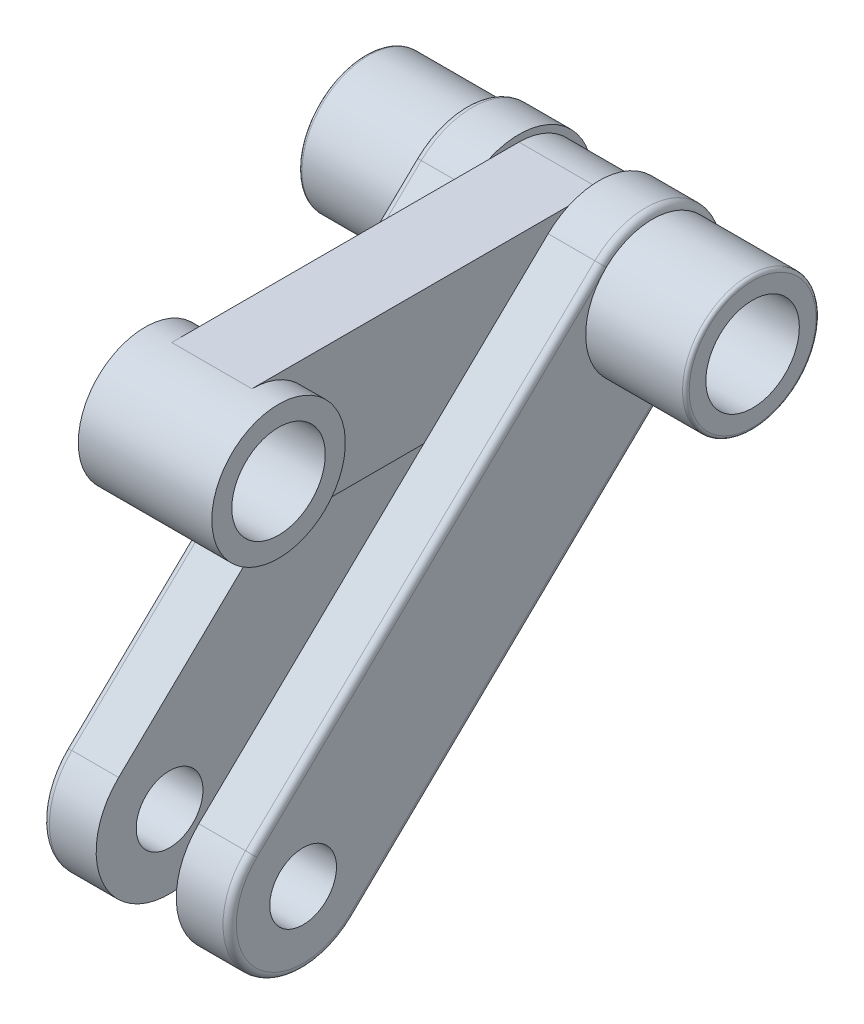
ISO-10303-21;
HEADER;
FILE_DESCRIPTION(('STEP AP214'),'2;1');
FILE_NAME('part.step','',(''),(''),'','','');
FILE_SCHEMA(('AUTOMOTIVE_DESIGN { 1 0 10303 214 1 1 1 1 }'));
ENDSEC;
DATA;
#1=APPLICATION_CONTEXT('core data for automotive mechanical design processes');
#2=APPLICATION_PROTOCOL_DEFINITION('international standard','automotive_design',2000,#1);
#3=PRODUCT_CONTEXT('',#1,'mechanical');
#4=PRODUCT('Part','Part','',(#3));
#5=PRODUCT_RELATED_PRODUCT_CATEGORY('part','',(#4));
#6=PRODUCT_DEFINITION_FORMATION('','',#4);
#7=PRODUCT_DEFINITION_CONTEXT('part definition',#1,'design');
#8=PRODUCT_DEFINITION('design','',#6,#7);
#9=PRODUCT_DEFINITION_SHAPE('','',#8);
#10=(LENGTH_UNIT() NAMED_UNIT(*) SI_UNIT(.MILLI.,.METRE.));
#11=(NAMED_UNIT(*) PLANE_ANGLE_UNIT() SI_UNIT($,.RADIAN.));
#12=(NAMED_UNIT(*) SI_UNIT($,.STERADIAN.) SOLID_ANGLE_UNIT());
#13=UNCERTAINTY_MEASURE_WITH_UNIT(LENGTH_MEASURE(1.E-05),#10,'distance_accuracy_value','');
#14=(GEOMETRIC_REPRESENTATION_CONTEXT(3) GLOBAL_UNCERTAINTY_ASSIGNED_CONTEXT((#13)) GLOBAL_UNIT_ASSIGNED_CONTEXT((#10,
#11,#12)) REPRESENTATION_CONTEXT('',''));
#15=CARTESIAN_POINT('',(0.,0.,0.));
#16=DIRECTION('',(0.,0.,1.));
#17=DIRECTION('',(1.,0.,0.));
#18=AXIS2_PLACEMENT_3D('',#15,#16,#17);
#19=CARTESIAN_POINT('',(-20.,0.,0.));
#20=DIRECTION('',(1.,0.,0.));
#21=DIRECTION('',(0.,0.,-1.));
#22=AXIS2_PLACEMENT_3D('',#19,#20,#21);
#23=PLANE('',#22);
#24=CARTESIAN_POINT('',(-20.,0.,0.));
#25=DIRECTION('',(1.,0.,0.));
#26=DIRECTION('',(0.,0.,-1.));
#27=AXIS2_PLACEMENT_3D('',#24,#25,#26);
#28=CIRCLE('',#27,10.);
#29=CARTESIAN_POINT('',(-20.,10.,0.));
#30=VERTEX_POINT('',#29);
#31=CARTESIAN_POINT('',(-20.,-10.,0.));
#32=VERTEX_POINT('',#31);
#33=EDGE_CURVE('E912',#30,#32,#28,.F.);
#34=ORIENTED_EDGE('',*,*,#33,.F.);
#35=DIRECTION('',(0.,0.,-1.));
#36=VECTOR('',#35,1.);
#37=CARTESIAN_POINT('',(-20.,10.,0.));
#38=LINE('',#37,#36);
#39=CARTESIAN_POINT('',(-20.,10.,-47.4174243050442));
#40=VERTEX_POINT('',#39);
#41=EDGE_CURVE('E808',#30,#40,#38,.T.);
#42=ORIENTED_EDGE('',*,*,#41,.T.);
#43=CARTESIAN_POINT('',(-20.,0.,-52.));
#44=DIRECTION('',(1.,0.,0.));
#45=DIRECTION('',(0.,0.,-1.));
#46=AXIS2_PLACEMENT_3D('',#43,#44,#45);
#47=CIRCLE('',#46,11.);
#48=CARTESIAN_POINT('',(-20.,7.92486428845387,-44.3713352407129));
#49=VERTEX_POINT('',#48);
#50=EDGE_CURVE('E828',#40,#49,#47,.T.);
#51=ORIENTED_EDGE('',*,*,#50,.T.);
#52=DIRECTION('',(0.,0.693514978117007,-0.720442208041261));
#53=VECTOR('',#52,1.);
#54=CARTESIAN_POINT('',(-20.,-18.0562837430499,-17.3814125340898));
#55=LINE('',#54,#53);
#56=CARTESIAN_POINT('',(-20.,-10.,-25.7504990449662));
#57=VERTEX_POINT('',#56);
#58=EDGE_CURVE('E928',#57,#49,#55,.T.);
#59=ORIENTED_EDGE('',*,*,#58,.F.);
#60=DIRECTION('',(0.,0.,-1.));
#61=VECTOR('',#60,1.);
#62=CARTESIAN_POINT('',(-20.,-10.,0.));
#63=LINE('',#62,#61);
#64=EDGE_CURVE('E801',#32,#57,#63,.T.);
#65=ORIENTED_EDGE('',*,*,#64,.F.);
#66=EDGE_LOOP('',(#34,#42,#51,#59,#65));
#67=FACE_BOUND('',#66,.T.);
#68=ADVANCED_FACE('F115',(#67),#23,.F.);
#69=CARTESIAN_POINT('',(-8.,0.,0.));
#70=DIRECTION('',(1.,0.,0.));
#71=DIRECTION('',(0.,0.,-1.));
#72=AXIS2_PLACEMENT_3D('',#69,#70,#71);
#73=PLANE('',#72);
#74=DIRECTION('',(0.,0.,-1.));
#75=VECTOR('',#74,1.);
#76=CARTESIAN_POINT('',(-8.,10.,0.));
#77=LINE('',#76,#75);
#78=CARTESIAN_POINT('',(-8.,10.,0.));
#79=VERTEX_POINT('',#78);
#80=CARTESIAN_POINT('',(-8.,10.,-47.4174243050442));
#81=VERTEX_POINT('',#80);
#82=EDGE_CURVE('E791',#79,#81,#77,.T.);
#83=ORIENTED_EDGE('',*,*,#82,.F.);
#84=CARTESIAN_POINT('',(-8.,0.,0.));
#85=DIRECTION('',(1.,0.,0.));
#86=DIRECTION('',(0.,0.,-1.));
#87=AXIS2_PLACEMENT_3D('',#84,#85,#86);
#88=CIRCLE('',#87,10.);
#89=CARTESIAN_POINT('',(-8.,-10.,0.));
#90=VERTEX_POINT('',#89);
#91=EDGE_CURVE('E824',#79,#90,#88,.F.);
#92=ORIENTED_EDGE('',*,*,#91,.T.);
#93=DIRECTION('',(0.,0.,-1.));
#94=VECTOR('',#93,1.);
#95=CARTESIAN_POINT('',(-8.,-10.,0.));
#96=LINE('',#95,#94);
#97=CARTESIAN_POINT('',(-8.,-10.,-25.7504990449662));
#98=VERTEX_POINT('',#97);
#99=EDGE_CURVE('E776',#90,#98,#96,.T.);
#100=ORIENTED_EDGE('',*,*,#99,.T.);
#101=DIRECTION('',(0.,0.693514978117007,-0.720442208041261));
#102=VECTOR('',#101,1.);
#103=CARTESIAN_POINT('',(-8.,-18.0562837430499,-17.3814125340898));
#104=LINE('',#103,#102);
#105=CARTESIAN_POINT('',(-8.,7.92486428845387,-44.3713352407129));
#106=VERTEX_POINT('',#105);
#107=EDGE_CURVE('E771',#98,#106,#104,.T.);
#108=ORIENTED_EDGE('',*,*,#107,.T.);
#109=CARTESIAN_POINT('',(-8.,0.,-52.));
#110=DIRECTION('',(1.,0.,0.));
#111=DIRECTION('',(0.,0.,-1.));
#112=AXIS2_PLACEMENT_3D('',#109,#110,#111);
#113=CIRCLE('',#112,11.);
#114=EDGE_CURVE('E871',#81,#106,#113,.T.);
#115=ORIENTED_EDGE('',*,*,#114,.F.);
#116=EDGE_LOOP('',(#83,#92,#100,#108,#115));
#117=FACE_BOUND('',#116,.T.);
#118=ADVANCED_FACE('F334',(#117),#73,.T.);
#119=CARTESIAN_POINT('',(-20.,-10.,0.));
#120=DIRECTION('',(0.,-1.,0.));
#121=DIRECTION('',(0.,0.,-1.));
#122=AXIS2_PLACEMENT_3D('',#119,#120,#121);
#123=PLANE('',#122);
#124=CARTESIAN_POINT('',(-20.,-9.99999999992471,5.48764602092361E-05));
#125=VERTEX_POINT('',#124);
#126=EDGE_CURVE('E802',#125,#32,#63,.T.);
#127=ORIENTED_EDGE('',*,*,#126,.T.);
#128=ORIENTED_EDGE('',*,*,#64,.T.);
#129=CARTESIAN_POINT('',(-20.,-9.99999999999999,-52.));
#130=VERTEX_POINT('',#129);
#131=EDGE_CURVE('E799',#57,#130,#63,.T.);
#132=ORIENTED_EDGE('',*,*,#131,.T.);
#133=DIRECTION('',(1.,0.,0.));
#134=VECTOR('',#133,1.);
#135=CARTESIAN_POINT('',(-20.,-9.99999999999999,-52.));
#136=LINE('',#135,#134);
#137=CARTESIAN_POINT('',(-8.,-9.99999999999999,-52.));
#138=VERTEX_POINT('',#137);
#139=EDGE_CURVE('E777',#130,#138,#136,.T.);
#140=ORIENTED_EDGE('',*,*,#139,.T.);
#141=EDGE_CURVE('E762',#98,#138,#96,.T.);
#142=ORIENTED_EDGE('',*,*,#141,.F.);
#143=ORIENTED_EDGE('',*,*,#99,.F.);
#144=CARTESIAN_POINT('',(-8.,-9.99999999984943,5.4876460208823E-05));
#145=VERTEX_POINT('',#144);
#146=EDGE_CURVE('E783',#145,#90,#96,.T.);
#147=ORIENTED_EDGE('',*,*,#146,.F.);
#148=DIRECTION('',(1.,0.,0.));
#149=VECTOR('',#148,1.);
#150=CARTESIAN_POINT('',(-20.,-9.99999999992471,5.48764602092361E-05));
#151=LINE('',#150,#149);
#152=EDGE_CURVE('E935',#125,#145,#151,.T.);
#153=ORIENTED_EDGE('',*,*,#152,.F.);
#154=EDGE_LOOP('',(#127,#128,#132,#140,#142,#143,#147,#153));
#155=FACE_BOUND('',#154,.T.);
#156=ADVANCED_FACE('F339',(#155),#123,.T.);
#157=CARTESIAN_POINT('',(-20.,0.,0.));
#158=DIRECTION('',(1.,0.,0.));
#159=DIRECTION('',(0.,0.,-1.));
#160=AXIS2_PLACEMENT_3D('',#157,#158,#159);
#161=CYLINDRICAL_SURFACE('',#160,10.);
#162=ORIENTED_EDGE('',*,*,#152,.T.);
#163=ORIENTED_EDGE('',*,*,#146,.T.);
#164=ORIENTED_EDGE('',*,*,#91,.F.);
#165=CARTESIAN_POINT('',(-8.,9.99999999984943,5.48764602112723E-05));
#166=VERTEX_POINT('',#165);
#167=EDGE_CURVE('E794',#166,#79,#77,.T.);
#168=ORIENTED_EDGE('',*,*,#167,.F.);
#169=DIRECTION('',(1.,0.,0.));
#170=VECTOR('',#169,1.);
#171=CARTESIAN_POINT('',(-20.,9.99999999992471,5.48764602116854E-05));
#172=LINE('',#171,#170);
#173=CARTESIAN_POINT('',(-20.,9.99999999992471,5.48764602116854E-05));
#174=VERTEX_POINT('',#173);
#175=EDGE_CURVE('E819',#174,#166,#172,.T.);
#176=ORIENTED_EDGE('',*,*,#175,.F.);
#177=EDGE_CURVE('E813',#174,#30,#38,.T.);
#178=ORIENTED_EDGE('',*,*,#177,.T.);
#179=ORIENTED_EDGE('',*,*,#33,.T.);
#180=ORIENTED_EDGE('',*,*,#126,.F.);
#181=EDGE_LOOP('',(#162,#163,#164,#168,#176,#178,#179,#180));
#182=FACE_BOUND('',#181,.T.);
#183=CARTESIAN_POINT('',(-4.,0.,0.));
#184=DIRECTION('',(-1.,0.,0.));
#185=DIRECTION('',(0.,0.,1.));
#186=AXIS2_PLACEMENT_3D('',#183,#184,#185);
#187=CIRCLE('',#186,10.);
#188=CARTESIAN_POINT('',(-4.,0.,10.));
#189=VERTEX_POINT('',#188);
#190=EDGE_CURVE('E910',#189,#189,#187,.T.);
#191=ORIENTED_EDGE('',*,*,#190,.T.);
#192=EDGE_LOOP('',(#191));
#193=FACE_BOUND('',#192,.T.);
#194=CARTESIAN_POINT('',(-24.,0.,0.));
#195=DIRECTION('',(-1.,0.,0.));
#196=DIRECTION('',(0.,0.,1.));
#197=AXIS2_PLACEMENT_3D('',#194,#195,#196);
#198=CIRCLE('',#197,10.);
#199=CARTESIAN_POINT('',(-24.,0.,10.));
#200=VERTEX_POINT('',#199);
#201=EDGE_CURVE('E907',#200,#200,#198,.T.);
#202=ORIENTED_EDGE('',*,*,#201,.F.);
#203=EDGE_LOOP('',(#202));
#204=FACE_BOUND('',#203,.T.);
#205=ADVANCED_FACE('F351',(#182,#193,#204),#161,.T.);
#206=CARTESIAN_POINT('',(-20.,10.,0.));
#207=DIRECTION('',(0.,-1.,0.));
#208=DIRECTION('',(0.,0.,-1.));
#209=AXIS2_PLACEMENT_3D('',#206,#207,#208);
#210=PLANE('',#209);
#211=ORIENTED_EDGE('',*,*,#167,.T.);
#212=ORIENTED_EDGE('',*,*,#82,.T.);
#213=CARTESIAN_POINT('',(-8.,10.,-52.));
#214=VERTEX_POINT('',#213);
#215=EDGE_CURVE('E788',#81,#214,#77,.T.);
#216=ORIENTED_EDGE('',*,*,#215,.T.);
#217=DIRECTION('',(1.,0.,0.));
#218=VECTOR('',#217,1.);
#219=CARTESIAN_POINT('',(-20.,10.,-52.));
#220=LINE('',#219,#218);
#221=CARTESIAN_POINT('',(-20.,10.,-52.));
#222=VERTEX_POINT('',#221);
#223=EDGE_CURVE('E820',#222,#214,#220,.T.);
#224=ORIENTED_EDGE('',*,*,#223,.F.);
#225=EDGE_CURVE('E807',#40,#222,#38,.T.);
#226=ORIENTED_EDGE('',*,*,#225,.F.);
#227=ORIENTED_EDGE('',*,*,#41,.F.);
#228=ORIENTED_EDGE('',*,*,#177,.F.);
#229=ORIENTED_EDGE('',*,*,#175,.T.);
#230=EDGE_LOOP('',(#211,#212,#216,#224,#226,#227,#228,#229));
#231=FACE_BOUND('',#230,.T.);
#232=ADVANCED_FACE('F357',(#231),#210,.F.);
#233=CARTESIAN_POINT('',(-20.,0.,-52.));
#234=DIRECTION('',(1.,0.,0.));
#235=DIRECTION('',(0.,0.,-1.));
#236=AXIS2_PLACEMENT_3D('',#233,#234,#235);
#237=CYLINDRICAL_SURFACE('',#236,10.);
#238=ORIENTED_EDGE('',*,*,#139,.F.);
#239=CARTESIAN_POINT('',(-20.,0.,-52.));
#240=DIRECTION('',(1.,0.,0.));
#241=DIRECTION('',(0.,0.,-1.));
#242=AXIS2_PLACEMENT_3D('',#239,#240,#241);
#243=CIRCLE('',#242,10.);
#244=EDGE_CURVE('E785',#130,#222,#243,.T.);
#245=ORIENTED_EDGE('',*,*,#244,.T.);
#246=ORIENTED_EDGE('',*,*,#223,.T.);
#247=CARTESIAN_POINT('',(-8.,0.,-52.));
#248=DIRECTION('',(1.,0.,0.));
#249=DIRECTION('',(0.,0.,-1.));
#250=AXIS2_PLACEMENT_3D('',#247,#248,#249);
#251=CIRCLE('',#250,10.);
#252=EDGE_CURVE('E787',#138,#214,#251,.T.);
#253=ORIENTED_EDGE('',*,*,#252,.F.);
#254=EDGE_LOOP('',(#238,#245,#246,#253));
#255=FACE_BOUND('',#254,.T.);
#256=ADVANCED_FACE('F345',(#255),#237,.T.);
#257=CARTESIAN_POINT('',(-8.,0.,0.));
#258=DIRECTION('',(1.,0.,0.));
#259=DIRECTION('',(0.,0.,-1.));
#260=AXIS2_PLACEMENT_3D('',#257,#258,#259);
#261=PLANE('',#260);
#262=CARTESIAN_POINT('',(-8.,-50.3689230785121,0.324606251288995));
#263=DIRECTION('',(1.,0.,0.));
#264=DIRECTION('',(0.,0.,-1.));
#265=AXIS2_PLACEMENT_3D('',#262,#263,#264);
#266=CIRCLE('',#265,5.);
#267=CARTESIAN_POINT('',(-8.,-50.3689230785121,-4.67539374871101));
#268=VERTEX_POINT('',#267);
#269=EDGE_CURVE('E758',#268,#268,#266,.T.);
#270=ORIENTED_EDGE('',*,*,#269,.T.);
#271=EDGE_LOOP('',(#270));
#272=FACE_BOUND('',#271,.T.);
#273=CARTESIAN_POINT('',(-8.,-42.4440587900583,7.95327101057607));
#274=VERTEX_POINT('',#273);
#275=EDGE_CURVE('E765',#274,#98,#104,.T.);
#276=ORIENTED_EDGE('',*,*,#275,.T.);
#277=ORIENTED_EDGE('',*,*,#141,.T.);
#278=ORIENTED_EDGE('',*,*,#252,.T.);
#279=ORIENTED_EDGE('',*,*,#215,.F.);
#280=CARTESIAN_POINT('',(-8.,-7.92486428845388,-59.6286647592871));
#281=VERTEX_POINT('',#280);
#282=EDGE_CURVE('E775',#281,#81,#113,.T.);
#283=ORIENTED_EDGE('',*,*,#282,.F.);
#284=DIRECTION('',(0.,0.693514978117007,-0.720442208041261));
#285=VECTOR('',#284,1.);
#286=CARTESIAN_POINT('',(-8.,-33.9060123199576,-32.638742052664));
#287=LINE('',#286,#285);
#288=CARTESIAN_POINT('',(-8.,-58.293787366966,-7.30405850799808));
#289=VERTEX_POINT('',#288);
#290=EDGE_CURVE('E869',#289,#281,#287,.T.);
#291=ORIENTED_EDGE('',*,*,#290,.F.);
#292=CARTESIAN_POINT('',(-8.,-50.3689230785121,0.324606251288995));
#293=DIRECTION('',(1.,0.,0.));
#294=DIRECTION('',(0.,0.,-1.));
#295=AXIS2_PLACEMENT_3D('',#292,#293,#294);
#296=CIRCLE('',#295,11.);
#297=EDGE_CURVE('E767',#274,#289,#296,.T.);
#298=ORIENTED_EDGE('',*,*,#297,.F.);
#299=EDGE_LOOP('',(#276,#277,#278,#279,#283,#291,#298));
#300=FACE_BOUND('',#299,.T.);
#301=ADVANCED_FACE('F365',(#272,#300),#261,.F.);
#302=CARTESIAN_POINT('',(-8.,0.,-52.));
#303=DIRECTION('',(1.,0.,0.));
#304=DIRECTION('',(0.,0.,-1.));
#305=AXIS2_PLACEMENT_3D('',#302,#303,#304);
#306=CYLINDRICAL_SURFACE('',#305,11.);
#307=DIRECTION('',(1.,0.,0.));
#308=VECTOR('',#307,1.);
#309=CARTESIAN_POINT('',(-8.,7.92486428845387,-44.3713352407129));
#310=LINE('',#309,#308);
#311=CARTESIAN_POINT('',(-1.,7.92486428845387,-44.3713352407129));
#312=VERTEX_POINT('',#311);
#313=EDGE_CURVE('E877',#106,#312,#310,.T.);
#314=ORIENTED_EDGE('',*,*,#313,.T.);
#315=CARTESIAN_POINT('',(-1.,0.,-52.));
#316=DIRECTION('',(1.,0.,0.));
#317=DIRECTION('',(0.,0.,-1.));
#318=AXIS2_PLACEMENT_3D('',#315,#316,#317);
#319=CIRCLE('',#318,11.);
#320=CARTESIAN_POINT('',(-1.,-7.92486428845388,-59.6286647592871));
#321=VERTEX_POINT('',#320);
#322=EDGE_CURVE('E841',#312,#321,#319,.F.);
#323=ORIENTED_EDGE('',*,*,#322,.T.);
#324=DIRECTION('',(1.,0.,0.));
#325=VECTOR('',#324,1.);
#326=CARTESIAN_POINT('',(-8.,-7.92486428845388,-59.6286647592871));
#327=LINE('',#326,#325);
#328=EDGE_CURVE('E879',#281,#321,#327,.T.);
#329=ORIENTED_EDGE('',*,*,#328,.F.);
#330=ORIENTED_EDGE('',*,*,#282,.T.);
#331=ORIENTED_EDGE('',*,*,#114,.T.);
#332=EDGE_LOOP('',(#314,#323,#329,#330,#331));
#333=FACE_BOUND('',#332,.T.);
#334=ADVANCED_FACE('F587',(#333),#306,.T.);
#335=CARTESIAN_POINT('',(-8.,-50.3689230785121,0.324606251288995));
#336=DIRECTION('',(1.,0.,0.));
#337=DIRECTION('',(0.,0.,-1.));
#338=AXIS2_PLACEMENT_3D('',#335,#336,#337);
#339=CYLINDRICAL_SURFACE('',#338,5.);
#340=ORIENTED_EDGE('',*,*,#269,.F.);
#341=EDGE_LOOP('',(#340));
#342=FACE_BOUND('',#341,.T.);
#343=CARTESIAN_POINT('',(0.,-50.3689230785121,0.324606251288995));
#344=DIRECTION('',(1.,0.,0.));
#345=DIRECTION('',(0.,0.,-1.));
#346=AXIS2_PLACEMENT_3D('',#343,#344,#345);
#347=CIRCLE('',#346,5.);
#348=CARTESIAN_POINT('',(0.,-50.3689230785121,-4.67539374871101));
#349=VERTEX_POINT('',#348);
#350=EDGE_CURVE('E853',#349,#349,#347,.T.);
#351=ORIENTED_EDGE('',*,*,#350,.T.);
#352=EDGE_LOOP('',(#351));
#353=FACE_BOUND('',#352,.T.);
#354=ADVANCED_FACE('F342',(#342,#353),#339,.F.);
#355=CARTESIAN_POINT('',(-8.,-33.9060123199576,-32.638742052664));
#356=DIRECTION('',(0.,-0.720442208041261,-0.693514978117007));
#357=DIRECTION('',(0.,0.693514978117007,-0.720442208041261));
#358=AXIS2_PLACEMENT_3D('',#355,#356,#357);
#359=PLANE('',#358);
#360=ORIENTED_EDGE('',*,*,#328,.T.);
#361=DIRECTION('',(0.,0.693514978117007,-0.720442208041261));
#362=VECTOR('',#361,1.);
#363=CARTESIAN_POINT('',(-1.,-33.9060123199576,-32.638742052664));
#364=LINE('',#363,#362);
#365=CARTESIAN_POINT('',(-1.,-58.293787366966,-7.30405850799808));
#366=VERTEX_POINT('',#365);
#367=EDGE_CURVE('E843',#321,#366,#364,.F.);
#368=ORIENTED_EDGE('',*,*,#367,.T.);
#369=DIRECTION('',(1.,0.,0.));
#370=VECTOR('',#369,1.);
#371=CARTESIAN_POINT('',(-8.,-58.293787366966,-7.30405850799808));
#372=LINE('',#371,#370);
#373=EDGE_CURVE('E772',#289,#366,#372,.T.);
#374=ORIENTED_EDGE('',*,*,#373,.F.);
#375=ORIENTED_EDGE('',*,*,#290,.T.);
#376=EDGE_LOOP('',(#360,#368,#374,#375));
#377=FACE_BOUND('',#376,.T.);
#378=ADVANCED_FACE('F613',(#377),#359,.T.);
#379=CARTESIAN_POINT('',(-8.,-50.3689230785121,0.324606251288995));
#380=DIRECTION('',(1.,0.,0.));
#381=DIRECTION('',(0.,0.,-1.));
#382=AXIS2_PLACEMENT_3D('',#379,#380,#381);
#383=CYLINDRICAL_SURFACE('',#382,11.);
#384=ORIENTED_EDGE('',*,*,#373,.T.);
#385=CARTESIAN_POINT('',(-1.,-50.3689230785121,0.324606251288995));
#386=DIRECTION('',(1.,0.,0.));
#387=DIRECTION('',(0.,0.,-1.));
#388=AXIS2_PLACEMENT_3D('',#385,#386,#387);
#389=CIRCLE('',#388,11.);
#390=CARTESIAN_POINT('',(-1.,-42.4440587900583,7.95327101057607));
#391=VERTEX_POINT('',#390);
#392=EDGE_CURVE('E839',#366,#391,#389,.F.);
#393=ORIENTED_EDGE('',*,*,#392,.T.);
#394=DIRECTION('',(1.,0.,0.));
#395=VECTOR('',#394,1.);
#396=CARTESIAN_POINT('',(-8.,-42.4440587900583,7.95327101057607));
#397=LINE('',#396,#395);
#398=EDGE_CURVE('E822',#274,#391,#397,.T.);
#399=ORIENTED_EDGE('',*,*,#398,.F.);
#400=ORIENTED_EDGE('',*,*,#297,.T.);
#401=EDGE_LOOP('',(#384,#393,#399,#400));
#402=FACE_BOUND('',#401,.T.);
#403=ADVANCED_FACE('F606',(#402),#383,.T.);
#404=CARTESIAN_POINT('',(-8.,-18.0562837430499,-17.3814125340898));
#405=DIRECTION('',(0.,-0.720442208041261,-0.693514978117007));
#406=DIRECTION('',(0.,0.693514978117007,-0.720442208041261));
#407=AXIS2_PLACEMENT_3D('',#404,#405,#406);
#408=PLANE('',#407);
#409=ORIENTED_EDGE('',*,*,#398,.T.);
#410=DIRECTION('',(0.,0.693514978117007,-0.720442208041261));
#411=VECTOR('',#410,1.);
#412=CARTESIAN_POINT('',(-1.,7.92486428845387,-44.3713352407129));
#413=LINE('',#412,#411);
#414=EDGE_CURVE('E292',#391,#312,#413,.T.);
#415=ORIENTED_EDGE('',*,*,#414,.T.);
#416=ORIENTED_EDGE('',*,*,#313,.F.);
#417=ORIENTED_EDGE('',*,*,#107,.F.);
#418=ORIENTED_EDGE('',*,*,#275,.F.);
#419=EDGE_LOOP('',(#409,#415,#416,#417,#418));
#420=FACE_BOUND('',#419,.T.);
#421=ADVANCED_FACE('F597',(#420),#408,.F.);
#422=CARTESIAN_POINT('',(0.,0.,0.));
#423=DIRECTION('',(1.,0.,0.));
#424=DIRECTION('',(0.,0.,-1.));
#425=AXIS2_PLACEMENT_3D('',#422,#423,#424);
#426=PLANE('',#425);
#427=DIRECTION('',(0.,0.693514978117007,-0.720442208041261));
#428=VECTOR('',#427,1.);
#429=CARTESIAN_POINT('',(0.,-33.1855701119164,-31.945227074547));
#430=LINE('',#429,#428);
#431=CARTESIAN_POINT('',(0.,-57.5733451589248,-6.61054352988108));
#432=VERTEX_POINT('',#431);
#433=CARTESIAN_POINT('',(0.,-7.20442208041261,-58.9351497811701));
#434=VERTEX_POINT('',#433);
#435=EDGE_CURVE('E832',#432,#434,#430,.T.);
#436=ORIENTED_EDGE('',*,*,#435,.T.);
#437=CARTESIAN_POINT('',(0.,0.,-52.));
#438=DIRECTION('',(1.,0.,0.));
#439=DIRECTION('',(0.,0.,-1.));
#440=AXIS2_PLACEMENT_3D('',#437,#438,#439);
#441=CIRCLE('',#440,9.99999999999975);
#442=CARTESIAN_POINT('',(0.,7.20442208041261,-45.0648502188299));
#443=VERTEX_POINT('',#442);
#444=EDGE_CURVE('E277',#434,#443,#441,.F.);
#445=ORIENTED_EDGE('',*,*,#444,.T.);
#446=DIRECTION('',(0.,0.693514978117007,-0.720442208041261));
#447=VECTOR('',#446,1.);
#448=CARTESIAN_POINT('',(0.,-43.1645009980995,7.25975603245907));
#449=LINE('',#448,#447);
#450=CARTESIAN_POINT('',(0.,-43.1645009980995,7.25975603245907));
#451=VERTEX_POINT('',#450);
#452=EDGE_CURVE('E830',#443,#451,#449,.F.);
#453=ORIENTED_EDGE('',*,*,#452,.T.);
#454=CARTESIAN_POINT('',(0.,-50.3689230785121,0.324606251288995));
#455=DIRECTION('',(1.,0.,0.));
#456=DIRECTION('',(0.,0.,-1.));
#457=AXIS2_PLACEMENT_3D('',#454,#455,#456);
#458=CIRCLE('',#457,9.99999999999999);
#459=EDGE_CURVE('E834',#451,#432,#458,.T.);
#460=ORIENTED_EDGE('',*,*,#459,.T.);
#461=EDGE_LOOP('',(#436,#445,#453,#460));
#462=FACE_BOUND('',#461,.T.);
#463=ORIENTED_EDGE('',*,*,#350,.F.);
#464=EDGE_LOOP('',(#463));
#465=FACE_BOUND('',#464,.T.);
#466=ADVANCED_FACE('F582',(#462,#465),#426,.T.);
#467=CARTESIAN_POINT('',(-20.,-50.3689230785121,0.324606251288995));
#468=DIRECTION('',(-1.,0.,0.));
#469=DIRECTION('',(0.,0.,1.));
#470=AXIS2_PLACEMENT_3D('',#467,#468,#469);
#471=CYLINDRICAL_SURFACE('',#470,11.);
#472=DIRECTION('',(-1.,0.,0.));
#473=VECTOR('',#472,1.);
#474=CARTESIAN_POINT('',(-20.,-42.4440587900583,7.95327101057607));
#475=LINE('',#474,#473);
#476=CARTESIAN_POINT('',(-20.,-42.4440587900583,7.95327101057607));
#477=VERTEX_POINT('',#476);
#478=CARTESIAN_POINT('',(-27.,-42.4440587900583,7.95327101057607));
#479=VERTEX_POINT('',#478);
#480=EDGE_CURVE('E849',#477,#479,#475,.T.);
#481=ORIENTED_EDGE('',*,*,#480,.T.);
#482=CARTESIAN_POINT('',(-27.,-50.3689230785121,0.324606251288995));
#483=DIRECTION('',(-1.,0.,0.));
#484=DIRECTION('',(0.,0.,1.));
#485=AXIS2_PLACEMENT_3D('',#482,#483,#484);
#486=CIRCLE('',#485,11.);
#487=CARTESIAN_POINT('',(-27.,-58.293787366966,-7.30405850799808));
#488=VERTEX_POINT('',#487);
#489=EDGE_CURVE('E284',#479,#488,#486,.F.);
#490=ORIENTED_EDGE('',*,*,#489,.T.);
#491=DIRECTION('',(-1.,0.,0.));
#492=VECTOR('',#491,1.);
#493=CARTESIAN_POINT('',(-20.,-58.293787366966,-7.30405850799808));
#494=LINE('',#493,#492);
#495=CARTESIAN_POINT('',(-20.,-58.293787366966,-7.30405850799808));
#496=VERTEX_POINT('',#495);
#497=EDGE_CURVE('E848',#496,#488,#494,.T.);
#498=ORIENTED_EDGE('',*,*,#497,.F.);
#499=CARTESIAN_POINT('',(-20.,-50.3689230785121,0.324606251288995));
#500=DIRECTION('',(1.,0.,0.));
#501=DIRECTION('',(0.,0.,-1.));
#502=AXIS2_PLACEMENT_3D('',#499,#500,#501);
#503=CIRCLE('',#502,11.);
#504=EDGE_CURVE('E918',#477,#496,#503,.T.);
#505=ORIENTED_EDGE('',*,*,#504,.F.);
#506=EDGE_LOOP('',(#481,#490,#498,#505));
#507=FACE_BOUND('',#506,.T.);
#508=ADVANCED_FACE('F580',(#507),#471,.T.);
#509=CARTESIAN_POINT('',(-20.,-33.9060123199576,-32.638742052664));
#510=DIRECTION('',(0.,0.720442208041261,0.693514978117007));
#511=DIRECTION('',(0.,-0.693514978117007,0.720442208041261));
#512=AXIS2_PLACEMENT_3D('',#509,#510,#511);
#513=PLANE('',#512);
#514=ORIENTED_EDGE('',*,*,#497,.T.);
#515=DIRECTION('',(0.,0.693514978117007,-0.720442208041261));
#516=VECTOR('',#515,1.);
#517=CARTESIAN_POINT('',(-27.,-7.92486428845388,-59.6286647592871));
#518=LINE('',#517,#516);
#519=CARTESIAN_POINT('',(-27.,-7.92486428845388,-59.6286647592871));
#520=VERTEX_POINT('',#519);
#521=EDGE_CURVE('E134',#488,#520,#518,.T.);
#522=ORIENTED_EDGE('',*,*,#521,.T.);
#523=DIRECTION('',(-1.,0.,0.));
#524=VECTOR('',#523,1.);
#525=CARTESIAN_POINT('',(-20.,-7.92486428845388,-59.6286647592871));
#526=LINE('',#525,#524);
#527=CARTESIAN_POINT('',(-20.,-7.92486428845386,-59.6286647592871));
#528=VERTEX_POINT('',#527);
#529=EDGE_CURVE('E857',#528,#520,#526,.T.);
#530=ORIENTED_EDGE('',*,*,#529,.F.);
#531=DIRECTION('',(0.,0.693514978117007,-0.720442208041261));
#532=VECTOR('',#531,1.);
#533=CARTESIAN_POINT('',(-20.,-33.9060123199576,-32.638742052664));
#534=LINE('',#533,#532);
#535=EDGE_CURVE('E855',#496,#528,#534,.T.);
#536=ORIENTED_EDGE('',*,*,#535,.F.);
#537=EDGE_LOOP('',(#514,#522,#530,#536));
#538=FACE_BOUND('',#537,.T.);
#539=ADVANCED_FACE('F567',(#538),#513,.F.);
#540=CARTESIAN_POINT('',(-20.,0.,-52.));
#541=DIRECTION('',(-1.,0.,0.));
#542=DIRECTION('',(0.,0.,1.));
#543=AXIS2_PLACEMENT_3D('',#540,#541,#542);
#544=CYLINDRICAL_SURFACE('',#543,11.);
#545=ORIENTED_EDGE('',*,*,#529,.T.);
#546=CARTESIAN_POINT('',(-27.,0.,-52.));
#547=DIRECTION('',(-1.,0.,0.));
#548=DIRECTION('',(0.,0.,1.));
#549=AXIS2_PLACEMENT_3D('',#546,#547,#548);
#550=CIRCLE('',#549,11.);
#551=CARTESIAN_POINT('',(-27.,7.92486428845387,-44.3713352407129));
#552=VERTEX_POINT('',#551);
#553=EDGE_CURVE('E130',#520,#552,#550,.F.);
#554=ORIENTED_EDGE('',*,*,#553,.T.);
#555=DIRECTION('',(-1.,0.,0.));
#556=VECTOR('',#555,1.);
#557=CARTESIAN_POINT('',(-20.,7.92486428845387,-44.3713352407129));
#558=LINE('',#557,#556);
#559=EDGE_CURVE('E858',#49,#552,#558,.T.);
#560=ORIENTED_EDGE('',*,*,#559,.F.);
#561=ORIENTED_EDGE('',*,*,#50,.F.);
#562=EDGE_CURVE('E923',#528,#40,#47,.T.);
#563=ORIENTED_EDGE('',*,*,#562,.F.);
#564=EDGE_LOOP('',(#545,#554,#560,#561,#563));
#565=FACE_BOUND('',#564,.T.);
#566=ADVANCED_FACE('F557',(#565),#544,.T.);
#567=CARTESIAN_POINT('',(-20.,-50.3689230785121,0.324606251288995));
#568=DIRECTION('',(-1.,0.,0.));
#569=DIRECTION('',(0.,0.,1.));
#570=AXIS2_PLACEMENT_3D('',#567,#568,#569);
#571=CYLINDRICAL_SURFACE('',#570,5.);
#572=CARTESIAN_POINT('',(-20.,-50.3689230785121,0.324606251288995));
#573=DIRECTION('',(1.,0.,0.));
#574=DIRECTION('',(0.,0.,-1.));
#575=AXIS2_PLACEMENT_3D('',#572,#573,#574);
#576=CIRCLE('',#575,5.);
#577=CARTESIAN_POINT('',(-20.,-50.3689230785121,-4.67539374871101));
#578=VERTEX_POINT('',#577);
#579=EDGE_CURVE('E919',#578,#578,#576,.T.);
#580=ORIENTED_EDGE('',*,*,#579,.T.);
#581=EDGE_LOOP('',(#580));
#582=FACE_BOUND('',#581,.T.);
#583=CARTESIAN_POINT('',(-28.,-50.3689230785121,0.324606251288995));
#584=DIRECTION('',(1.,0.,0.));
#585=DIRECTION('',(0.,0.,-1.));
#586=AXIS2_PLACEMENT_3D('',#583,#584,#585);
#587=CIRCLE('',#586,5.);
#588=CARTESIAN_POINT('',(-28.,-50.3689230785121,-4.67539374871101));
#589=VERTEX_POINT('',#588);
#590=EDGE_CURVE('E861',#589,#589,#587,.T.);
#591=ORIENTED_EDGE('',*,*,#590,.F.);
#592=EDGE_LOOP('',(#591));
#593=FACE_BOUND('',#592,.T.);
#594=ADVANCED_FACE('F553',(#582,#593),#571,.F.);
#595=CARTESIAN_POINT('',(-20.,-18.0562837430499,-17.3814125340898));
#596=DIRECTION('',(0.,0.720442208041261,0.693514978117007));
#597=DIRECTION('',(0.,-0.693514978117007,0.720442208041261));
#598=AXIS2_PLACEMENT_3D('',#595,#596,#597);
#599=PLANE('',#598);
#600=ORIENTED_EDGE('',*,*,#559,.T.);
#601=DIRECTION('',(0.,0.693514978117007,-0.720442208041261));
#602=VECTOR('',#601,1.);
#603=CARTESIAN_POINT('',(-27.,-18.0562837430499,-17.3814125340898));
#604=LINE('',#603,#602);
#605=EDGE_CURVE('E295',#552,#479,#604,.F.);
#606=ORIENTED_EDGE('',*,*,#605,.T.);
#607=ORIENTED_EDGE('',*,*,#480,.F.);
#608=EDGE_CURVE('E925',#477,#57,#55,.T.);
#609=ORIENTED_EDGE('',*,*,#608,.T.);
#610=ORIENTED_EDGE('',*,*,#58,.T.);
#611=EDGE_LOOP('',(#600,#606,#607,#609,#610));
#612=FACE_BOUND('',#611,.T.);
#613=ADVANCED_FACE('F541',(#612),#599,.T.);
#614=CARTESIAN_POINT('',(-20.,0.,0.));
#615=DIRECTION('',(-1.,0.,0.));
#616=DIRECTION('',(0.,0.,-1.));
#617=AXIS2_PLACEMENT_3D('',#614,#615,#616);
#618=PLANE('',#617);
#619=ORIENTED_EDGE('',*,*,#131,.F.);
#620=ORIENTED_EDGE('',*,*,#608,.F.);
#621=ORIENTED_EDGE('',*,*,#504,.T.);
#622=ORIENTED_EDGE('',*,*,#535,.T.);
#623=ORIENTED_EDGE('',*,*,#562,.T.);
#624=ORIENTED_EDGE('',*,*,#225,.T.);
#625=ORIENTED_EDGE('',*,*,#244,.F.);
#626=EDGE_LOOP('',(#619,#620,#621,#622,#623,#624,#625));
#627=FACE_BOUND('',#626,.T.);
#628=ORIENTED_EDGE('',*,*,#579,.F.);
#629=EDGE_LOOP('',(#628));
#630=FACE_BOUND('',#629,.T.);
#631=ADVANCED_FACE('F535',(#627,#630),#618,.F.);
#632=CARTESIAN_POINT('',(-28.,0.,0.));
#633=DIRECTION('',(-1.,0.,0.));
#634=DIRECTION('',(0.,0.,-1.));
#635=AXIS2_PLACEMENT_3D('',#632,#633,#634);
#636=PLANE('',#635);
#637=DIRECTION('',(0.,0.693514978117007,-0.720442208041261));
#638=VECTOR('',#637,1.);
#639=CARTESIAN_POINT('',(-28.,-18.7767259510912,-18.0749275122068));
#640=LINE('',#639,#638);
#641=CARTESIAN_POINT('',(-28.,-43.1645009980995,7.25975603245907));
#642=VERTEX_POINT('',#641);
#643=CARTESIAN_POINT('',(-28.,7.20442208041261,-45.0648502188299));
#644=VERTEX_POINT('',#643);
#645=EDGE_CURVE('E276',#642,#644,#640,.T.);
#646=ORIENTED_EDGE('',*,*,#645,.T.);
#647=CARTESIAN_POINT('',(-28.,0.,-52.));
#648=DIRECTION('',(-1.,0.,0.));
#649=DIRECTION('',(0.,0.,1.));
#650=AXIS2_PLACEMENT_3D('',#647,#648,#649);
#651=CIRCLE('',#650,9.99999999999975);
#652=CARTESIAN_POINT('',(-28.,-7.20442208041259,-58.9351497811701));
#653=VERTEX_POINT('',#652);
#654=EDGE_CURVE('E274',#644,#653,#651,.F.);
#655=ORIENTED_EDGE('',*,*,#654,.T.);
#656=DIRECTION('',(0.,0.693514978117007,-0.720442208041261));
#657=VECTOR('',#656,1.);
#658=CARTESIAN_POINT('',(-28.,-57.5733451589247,-6.61054352988108));
#659=LINE('',#658,#657);
#660=CARTESIAN_POINT('',(-28.,-57.5733451589247,-6.61054352988108));
#661=VERTEX_POINT('',#660);
#662=EDGE_CURVE('E255',#653,#661,#659,.F.);
#663=ORIENTED_EDGE('',*,*,#662,.T.);
#664=CARTESIAN_POINT('',(-28.,-50.3689230785121,0.324606251288995));
#665=DIRECTION('',(-1.,0.,0.));
#666=DIRECTION('',(0.,0.,1.));
#667=AXIS2_PLACEMENT_3D('',#664,#665,#666);
#668=CIRCLE('',#667,9.99999999999999);
#669=EDGE_CURVE('E261',#661,#642,#668,.T.);
#670=ORIENTED_EDGE('',*,*,#669,.T.);
#671=EDGE_LOOP('',(#646,#655,#663,#670));
#672=FACE_BOUND('',#671,.T.);
#673=ORIENTED_EDGE('',*,*,#590,.T.);
#674=EDGE_LOOP('',(#673));
#675=FACE_BOUND('',#674,.T.);
#676=ADVANCED_FACE('F273',(#672,#675),#636,.T.);
#677=CARTESIAN_POINT('',(-4.,0.,0.));
#678=DIRECTION('',(-1.,0.,0.));
#679=DIRECTION('',(0.,0.,1.));
#680=AXIS2_PLACEMENT_3D('',#677,#678,#679);
#681=PLANE('',#680);
#682=ORIENTED_EDGE('',*,*,#190,.F.);
#683=EDGE_LOOP('',(#682));
#684=FACE_BOUND('',#683,.T.);
#685=CARTESIAN_POINT('',(-4.,0.,0.));
#686=DIRECTION('',(-1.,0.,0.));
#687=DIRECTION('',(0.,0.,1.));
#688=AXIS2_PLACEMENT_3D('',#685,#686,#687);
#689=CIRCLE('',#688,7.);
#690=CARTESIAN_POINT('',(-4.,0.,7.));
#691=VERTEX_POINT('',#690);
#692=EDGE_CURVE('E310',#691,#691,#689,.T.);
#693=ORIENTED_EDGE('',*,*,#692,.T.);
#694=EDGE_LOOP('',(#693));
#695=FACE_BOUND('',#694,.T.);
#696=ADVANCED_FACE('F501',(#684,#695),#681,.F.);
#697=CARTESIAN_POINT('',(-24.,0.,0.));
#698=DIRECTION('',(-1.,0.,0.));
#699=DIRECTION('',(0.,0.,1.));
#700=AXIS2_PLACEMENT_3D('',#697,#698,#699);
#701=PLANE('',#700);
#702=ORIENTED_EDGE('',*,*,#201,.T.);
#703=EDGE_LOOP('',(#702));
#704=FACE_BOUND('',#703,.T.);
#705=CARTESIAN_POINT('',(-24.,0.,0.));
#706=DIRECTION('',(-1.,0.,0.));
#707=DIRECTION('',(0.,0.,1.));
#708=AXIS2_PLACEMENT_3D('',#705,#706,#707);
#709=CIRCLE('',#708,7.);
#710=CARTESIAN_POINT('',(-24.,0.,7.));
#711=VERTEX_POINT('',#710);
#712=EDGE_CURVE('E901',#711,#711,#709,.T.);
#713=ORIENTED_EDGE('',*,*,#712,.F.);
#714=EDGE_LOOP('',(#713));
#715=FACE_BOUND('',#714,.T.);
#716=ADVANCED_FACE('F354',(#704,#715),#701,.T.);
#717=CARTESIAN_POINT('',(-20.,0.,0.));
#718=DIRECTION('',(1.,0.,0.));
#719=DIRECTION('',(0.,0.,-1.));
#720=AXIS2_PLACEMENT_3D('',#717,#718,#719);
#721=CYLINDRICAL_SURFACE('',#720,7.);
#722=ORIENTED_EDGE('',*,*,#692,.F.);
#723=EDGE_LOOP('',(#722));
#724=FACE_BOUND('',#723,.T.);
#725=ORIENTED_EDGE('',*,*,#712,.T.);
#726=EDGE_LOOP('',(#725));
#727=FACE_BOUND('',#726,.T.);
#728=ADVANCED_FACE('F347',(#724,#727),#721,.F.);
#729=CARTESIAN_POINT('',(-1.,0.,-52.));
#730=DIRECTION('',(1.,0.,0.));
#731=DIRECTION('',(0.,0.,-1.));
#732=AXIS2_PLACEMENT_3D('',#729,#730,#731);
#733=TOROIDAL_SURFACE('',#732,10.,1.);
#734=CARTESIAN_POINT('',(-1.,-7.20442208041261,-58.9351497811701));
#735=DIRECTION('',(0.,-0.693514978117005,0.720442208041263));
#736=DIRECTION('',(0.,-0.720442208041263,-0.693514978117005));
#737=AXIS2_PLACEMENT_3D('',#734,#735,#736);
#738=CIRCLE('',#737,1.);
#739=EDGE_CURVE('E301',#321,#434,#738,.T.);
#740=ORIENTED_EDGE('',*,*,#739,.F.);
#741=ORIENTED_EDGE('',*,*,#322,.F.);
#742=CARTESIAN_POINT('',(-1.,7.20442208041261,-45.0648502188299));
#743=DIRECTION('',(0.,-0.693514978117008,0.72044220804126));
#744=DIRECTION('',(0.,-0.72044220804126,-0.693514978117008));
#745=AXIS2_PLACEMENT_3D('',#742,#743,#744);
#746=CIRCLE('',#745,1.);
#747=EDGE_CURVE('E302',#443,#312,#746,.T.);
#748=ORIENTED_EDGE('',*,*,#747,.F.);
#749=CARTESIAN_POINT('',(0.,0.,-52.));
#750=DIRECTION('',(1.,0.,0.));
#751=DIRECTION('',(0.,0.,-1.));
#752=AXIS2_PLACEMENT_3D('',#749,#750,#751);
#753=CIRCLE('',#752,10.);
#754=EDGE_CURVE('E829',#434,#443,#753,.T.);
#755=ORIENTED_EDGE('',*,*,#754,.F.);
#756=EDGE_LOOP('',(#740,#741,#748,#755));
#757=FACE_BOUND('',#756,.T.);
#758=ADVANCED_FACE('F352',(#757),#733,.T.);
#759=CARTESIAN_POINT('',(-1.,-18.7767259510912,-18.0749275122068));
#760=DIRECTION('',(0.,-0.693514978117007,0.720442208041261));
#761=DIRECTION('',(0.,-0.720442208041261,-0.693514978117007));
#762=AXIS2_PLACEMENT_3D('',#759,#760,#761);
#763=CYLINDRICAL_SURFACE('',#762,1.);
#764=ORIENTED_EDGE('',*,*,#747,.T.);
#765=ORIENTED_EDGE('',*,*,#414,.F.);
#766=CARTESIAN_POINT('',(-1.,-43.1645009980995,7.25975603245907));
#767=DIRECTION('',(0.,-0.693514978117008,0.720442208041259));
#768=DIRECTION('',(0.,-0.720442208041259,-0.693514978117008));
#769=AXIS2_PLACEMENT_3D('',#766,#767,#768);
#770=CIRCLE('',#769,1.);
#771=EDGE_CURVE('E299',#451,#391,#770,.T.);
#772=ORIENTED_EDGE('',*,*,#771,.F.);
#773=ORIENTED_EDGE('',*,*,#452,.F.);
#774=EDGE_LOOP('',(#764,#765,#772,#773));
#775=FACE_BOUND('',#774,.T.);
#776=ADVANCED_FACE('F376',(#775),#763,.T.);
#777=CARTESIAN_POINT('',(-1.,-33.1855701119164,-31.945227074547));
#778=DIRECTION('',(0.,0.693514978117007,-0.720442208041261));
#779=DIRECTION('',(0.,0.720442208041261,0.693514978117007));
#780=AXIS2_PLACEMENT_3D('',#777,#778,#779);
#781=CYLINDRICAL_SURFACE('',#780,1.);
#782=ORIENTED_EDGE('',*,*,#739,.T.);
#783=ORIENTED_EDGE('',*,*,#435,.F.);
#784=CARTESIAN_POINT('',(-1.,-57.5733451589248,-6.61054352988108));
#785=DIRECTION('',(0.,-0.693514978117008,0.72044220804126));
#786=DIRECTION('',(0.,-0.72044220804126,-0.693514978117008));
#787=AXIS2_PLACEMENT_3D('',#784,#785,#786);
#788=CIRCLE('',#787,1.);
#789=EDGE_CURVE('E300',#366,#432,#788,.T.);
#790=ORIENTED_EDGE('',*,*,#789,.F.);
#791=ORIENTED_EDGE('',*,*,#367,.F.);
#792=EDGE_LOOP('',(#782,#783,#790,#791));
#793=FACE_BOUND('',#792,.T.);
#794=ADVANCED_FACE('F375',(#793),#781,.T.);
#795=CARTESIAN_POINT('',(-1.,-50.3689230785121,0.324606251288995));
#796=DIRECTION('',(1.,0.,0.));
#797=DIRECTION('',(0.,0.,-1.));
#798=AXIS2_PLACEMENT_3D('',#795,#796,#797);
#799=TOROIDAL_SURFACE('',#798,9.99999999999999,1.);
#800=ORIENTED_EDGE('',*,*,#771,.T.);
#801=ORIENTED_EDGE('',*,*,#392,.F.);
#802=ORIENTED_EDGE('',*,*,#789,.T.);
#803=ORIENTED_EDGE('',*,*,#459,.F.);
#804=EDGE_LOOP('',(#800,#801,#802,#803));
#805=FACE_BOUND('',#804,.T.);
#806=ADVANCED_FACE('F367',(#805),#799,.T.);
#807=CARTESIAN_POINT('',(-27.,0.,-52.));
#808=DIRECTION('',(-1.,0.,0.));
#809=DIRECTION('',(0.,0.,1.));
#810=AXIS2_PLACEMENT_3D('',#807,#808,#809);
#811=TOROIDAL_SURFACE('',#810,10.,1.);
#812=CARTESIAN_POINT('',(-27.,-7.20442208041261,-58.9351497811701));
#813=DIRECTION('',(0.,-0.693514978117009,0.720442208041258));
#814=DIRECTION('',(0.,-0.720442208041259,-0.693514978117009));
#815=AXIS2_PLACEMENT_3D('',#812,#813,#814);
#816=CIRCLE('',#815,1.);
#817=EDGE_CURVE('E253',#653,#520,#816,.T.);
#818=ORIENTED_EDGE('',*,*,#817,.F.);
#819=CARTESIAN_POINT('',(-28.,0.,-52.));
#820=DIRECTION('',(-1.,0.,0.));
#821=DIRECTION('',(0.,0.,1.));
#822=AXIS2_PLACEMENT_3D('',#819,#820,#821);
#823=CIRCLE('',#822,10.);
#824=EDGE_CURVE('E265',#644,#653,#823,.T.);
#825=ORIENTED_EDGE('',*,*,#824,.F.);
#826=CARTESIAN_POINT('',(-27.,7.20442208041261,-45.0648502188299));
#827=DIRECTION('',(0.,-0.693514978117009,0.720442208041259));
#828=DIRECTION('',(0.,-0.720442208041259,-0.693514978117009));
#829=AXIS2_PLACEMENT_3D('',#826,#827,#828);
#830=CIRCLE('',#829,1.);
#831=EDGE_CURVE('E268',#552,#644,#830,.T.);
#832=ORIENTED_EDGE('',*,*,#831,.F.);
#833=ORIENTED_EDGE('',*,*,#553,.F.);
#834=EDGE_LOOP('',(#818,#825,#832,#833));
#835=FACE_BOUND('',#834,.T.);
#836=ADVANCED_FACE('F267',(#835),#811,.T.);
#837=CARTESIAN_POINT('',(-27.,-18.7767259510912,-18.0749275122068));
#838=DIRECTION('',(0.,0.693514978117007,-0.720442208041261));
#839=DIRECTION('',(0.,0.720442208041261,0.693514978117007));
#840=AXIS2_PLACEMENT_3D('',#837,#838,#839);
#841=CYLINDRICAL_SURFACE('',#840,1.);
#842=ORIENTED_EDGE('',*,*,#831,.T.);
#843=ORIENTED_EDGE('',*,*,#645,.F.);
#844=CARTESIAN_POINT('',(-27.,-43.1645009980995,7.25975603245907));
#845=DIRECTION('',(0.,-0.693514978117007,0.72044220804126));
#846=DIRECTION('',(0.,-0.72044220804126,-0.693514978117007));
#847=AXIS2_PLACEMENT_3D('',#844,#845,#846);
#848=CIRCLE('',#847,1.);
#849=EDGE_CURVE('E272',#479,#642,#848,.T.);
#850=ORIENTED_EDGE('',*,*,#849,.F.);
#851=ORIENTED_EDGE('',*,*,#605,.F.);
#852=EDGE_LOOP('',(#842,#843,#850,#851));
#853=FACE_BOUND('',#852,.T.);
#854=ADVANCED_FACE('F391',(#853),#841,.T.);
#855=CARTESIAN_POINT('',(-27.,-33.1855701119164,-31.945227074547));
#856=DIRECTION('',(0.,-0.693514978117007,0.720442208041261));
#857=DIRECTION('',(0.,-0.720442208041261,-0.693514978117007));
#858=AXIS2_PLACEMENT_3D('',#855,#856,#857);
#859=CYLINDRICAL_SURFACE('',#858,1.);
#860=ORIENTED_EDGE('',*,*,#817,.T.);
#861=ORIENTED_EDGE('',*,*,#521,.F.);
#862=CARTESIAN_POINT('',(-27.,-57.5733451589247,-6.61054352988108));
#863=DIRECTION('',(0.,-0.693514978117006,0.720442208041262));
#864=DIRECTION('',(0.,-0.720442208041262,-0.693514978117006));
#865=AXIS2_PLACEMENT_3D('',#862,#863,#864);
#866=CIRCLE('',#865,1.);
#867=EDGE_CURVE('E258',#661,#488,#866,.T.);
#868=ORIENTED_EDGE('',*,*,#867,.F.);
#869=ORIENTED_EDGE('',*,*,#662,.F.);
#870=EDGE_LOOP('',(#860,#861,#868,#869));
#871=FACE_BOUND('',#870,.T.);
#872=ADVANCED_FACE('F251',(#871),#859,.T.);
#873=CARTESIAN_POINT('',(-27.,-50.3689230785121,0.324606251288995));
#874=DIRECTION('',(-1.,0.,0.));
#875=DIRECTION('',(0.,0.,1.));
#876=AXIS2_PLACEMENT_3D('',#873,#874,#875);
#877=TOROIDAL_SURFACE('',#876,9.99999999999999,1.);
#878=ORIENTED_EDGE('',*,*,#849,.T.);
#879=ORIENTED_EDGE('',*,*,#669,.F.);
#880=ORIENTED_EDGE('',*,*,#867,.T.);
#881=ORIENTED_EDGE('',*,*,#489,.F.);
#882=EDGE_LOOP('',(#878,#879,#880,#881));
#883=FACE_BOUND('',#882,.T.);
#884=ADVANCED_FACE('F381',(#883),#877,.T.);
#885=CARTESIAN_POINT('',(-43.,0.,-52.));
#886=DIRECTION('',(-1.,0.,0.));
#887=DIRECTION('',(0.,0.,1.));
#888=AXIS2_PLACEMENT_3D('',#885,#886,#887);
#889=PLANE('',#888);
#890=CARTESIAN_POINT('',(-43.,0.,-52.));
#891=DIRECTION('',(-1.,0.,0.));
#892=DIRECTION('',(0.,0.,1.));
#893=AXIS2_PLACEMENT_3D('',#890,#891,#892);
#894=CIRCLE('',#893,9.49999999999974);
#895=CARTESIAN_POINT('',(-43.,0.,-42.5000000000003));
#896=VERTEX_POINT('',#895);
#897=EDGE_CURVE('E298',#896,#896,#894,.T.);
#898=ORIENTED_EDGE('',*,*,#897,.T.);
#899=EDGE_LOOP('',(#898));
#900=FACE_BOUND('',#899,.T.);
#901=CARTESIAN_POINT('',(-43.,0.,-52.));
#902=DIRECTION('',(-1.,0.,0.));
#903=DIRECTION('',(0.,0.,1.));
#904=AXIS2_PLACEMENT_3D('',#901,#902,#903);
#905=CIRCLE('',#904,7.);
#906=CARTESIAN_POINT('',(-43.,0.,-59.));
#907=VERTEX_POINT('',#906);
#908=EDGE_CURVE('E281',#907,#907,#905,.T.);
#909=ORIENTED_EDGE('',*,*,#908,.F.);
#910=EDGE_LOOP('',(#909));
#911=FACE_BOUND('',#910,.T.);
#912=ADVANCED_FACE('F390',(#900,#911),#889,.T.);
#913=CARTESIAN_POINT('',(-43.,0.,-52.));
#914=DIRECTION('',(1.,0.,0.));
#915=DIRECTION('',(0.,0.,-1.));
#916=AXIS2_PLACEMENT_3D('',#913,#914,#915);
#917=CYLINDRICAL_SURFACE('',#916,9.99999999999975);
#918=CARTESIAN_POINT('',(-42.5,0.,-52.));
#919=DIRECTION('',(-1.,0.,0.));
#920=DIRECTION('',(0.,0.,1.));
#921=AXIS2_PLACEMENT_3D('',#918,#919,#920);
#922=CIRCLE('',#921,9.99999999999975);
#923=CARTESIAN_POINT('',(-42.5,0.,-42.0000000000003));
#924=VERTEX_POINT('',#923);
#925=EDGE_CURVE('E312',#924,#924,#922,.F.);
#926=ORIENTED_EDGE('',*,*,#925,.T.);
#927=EDGE_LOOP('',(#926));
#928=FACE_BOUND('',#927,.T.);
#929=ORIENTED_EDGE('',*,*,#654,.F.);
#930=ORIENTED_EDGE('',*,*,#824,.T.);
#931=EDGE_LOOP('',(#929,#930));
#932=FACE_BOUND('',#931,.T.);
#933=ADVANCED_FACE('F282',(#928,#932),#917,.T.);
#934=CARTESIAN_POINT('',(-43.,0.,-52.));
#935=DIRECTION('',(1.,0.,0.));
#936=DIRECTION('',(0.,0.,-1.));
#937=AXIS2_PLACEMENT_3D('',#934,#935,#936);
#938=CYLINDRICAL_SURFACE('',#937,7.);
#939=CARTESIAN_POINT('',(15.,0.,-52.));
#940=DIRECTION('',(-1.,0.,0.));
#941=DIRECTION('',(0.,0.,1.));
#942=AXIS2_PLACEMENT_3D('',#939,#940,#941);
#943=CIRCLE('',#942,7.);
#944=CARTESIAN_POINT('',(15.,0.,-59.));
#945=VERTEX_POINT('',#944);
#946=EDGE_CURVE('E946',#945,#945,#943,.T.);
#947=CARTESIAN_POINT('',(15.,0.,-59.));
#948=CARTESIAN_POINT('',(14.3958333333333,0.,-59.));
#949=CARTESIAN_POINT('',(13.7916666666667,0.,-59.));
#950=CARTESIAN_POINT('',(12.5833333333333,0.,-59.));
#951=CARTESIAN_POINT('',(11.9791666666667,0.,-59.));
#952=CARTESIAN_POINT('',(10.7708333333333,0.,-59.));
#953=CARTESIAN_POINT('',(10.1666666666667,0.,-59.));
#954=CARTESIAN_POINT('',(8.95833333333333,0.,-59.));
#955=CARTESIAN_POINT('',(8.35416666666667,0.,-59.));
#956=CARTESIAN_POINT('',(7.14583333333333,0.,-59.));
#957=CARTESIAN_POINT('',(6.54166666666667,0.,-59.));
#958=CARTESIAN_POINT('',(5.33333333333333,0.,-59.));
#959=CARTESIAN_POINT('',(4.72916666666666,0.,-59.));
#960=CARTESIAN_POINT('',(3.52083333333333,0.,-59.));
#961=CARTESIAN_POINT('',(2.91666666666666,0.,-59.));
#962=CARTESIAN_POINT('',(1.70833333333333,0.,-59.));
#963=CARTESIAN_POINT('',(1.10416666666667,0.,-59.));
#964=CARTESIAN_POINT('',(-0.104166666666669,0.,-59.));
#965=CARTESIAN_POINT('',(-0.708333333333339,0.,-59.));
#966=CARTESIAN_POINT('',(-1.91666666666667,0.,-59.));
#967=CARTESIAN_POINT('',(-2.52083333333334,0.,-59.));
#968=CARTESIAN_POINT('',(-3.72916666666667,0.,-59.));
#969=CARTESIAN_POINT('',(-4.33333333333334,0.,-59.));
#970=CARTESIAN_POINT('',(-5.54166666666667,0.,-59.));
#971=CARTESIAN_POINT('',(-6.14583333333334,0.,-59.));
#972=CARTESIAN_POINT('',(-7.35416666666667,0.,-59.));
#973=CARTESIAN_POINT('',(-7.95833333333334,0.,-59.));
#974=CARTESIAN_POINT('',(-9.16666666666667,0.,-59.));
#975=CARTESIAN_POINT('',(-9.77083333333334,0.,-59.));
#976=CARTESIAN_POINT('',(-10.9791666666667,0.,-59.));
#977=CARTESIAN_POINT('',(-11.5833333333333,0.,-59.));
#978=CARTESIAN_POINT('',(-12.7916666666667,0.,-59.));
#979=CARTESIAN_POINT('',(-13.3958333333333,0.,-59.));
#980=CARTESIAN_POINT('',(-14.6041666666667,0.,-59.));
#981=CARTESIAN_POINT('',(-15.2083333333333,0.,-59.));
#982=CARTESIAN_POINT('',(-16.4166666666667,0.,-59.));
#983=CARTESIAN_POINT('',(-17.0208333333333,0.,-59.));
#984=CARTESIAN_POINT('',(-18.2291666666667,0.,-59.));
#985=CARTESIAN_POINT('',(-18.8333333333333,0.,-59.));
#986=CARTESIAN_POINT('',(-20.0416666666667,0.,-59.));
#987=CARTESIAN_POINT('',(-20.6458333333333,0.,-59.));
#988=CARTESIAN_POINT('',(-21.8541666666667,0.,-59.));
#989=CARTESIAN_POINT('',(-22.4583333333333,0.,-59.));
#990=CARTESIAN_POINT('',(-23.6666666666667,0.,-59.));
#991=CARTESIAN_POINT('',(-24.2708333333333,0.,-59.));
#992=CARTESIAN_POINT('',(-25.4791666666667,0.,-59.));
#993=CARTESIAN_POINT('',(-26.0833333333333,0.,-59.));
#994=CARTESIAN_POINT('',(-27.2916666666667,0.,-59.));
#995=CARTESIAN_POINT('',(-27.8958333333333,0.,-59.));
#996=CARTESIAN_POINT('',(-29.1041666666667,0.,-59.));
#997=CARTESIAN_POINT('',(-29.7083333333333,0.,-59.));
#998=CARTESIAN_POINT('',(-30.9166666666667,0.,-59.));
#999=CARTESIAN_POINT('',(-31.5208333333333,0.,-59.));
#1000=CARTESIAN_POINT('',(-32.7291666666667,0.,-59.));
#1001=CARTESIAN_POINT('',(-33.3333333333333,0.,-59.));
#1002=CARTESIAN_POINT('',(-34.5416666666667,0.,-59.));
#1003=CARTESIAN_POINT('',(-35.1458333333333,0.,-59.));
#1004=CARTESIAN_POINT('',(-36.3541666666667,0.,-59.));
#1005=CARTESIAN_POINT('',(-36.9583333333333,0.,-59.));
#1006=CARTESIAN_POINT('',(-38.1666666666667,0.,-59.));
#1007=CARTESIAN_POINT('',(-38.7708333333333,0.,-59.));
#1008=CARTESIAN_POINT('',(-39.9791666666667,0.,-59.));
#1009=CARTESIAN_POINT('',(-40.5833333333333,0.,-59.));
#1010=CARTESIAN_POINT('',(-41.7916666666667,0.,-59.));
#1011=CARTESIAN_POINT('',(-42.3958333333333,0.,-59.));
#1012=CARTESIAN_POINT('',(-43.,0.,-59.));
#1013=B_SPLINE_CURVE_WITH_KNOTS('',3,(#947,#948,#949,#950,#951,#952,#953,#954,#955,#956,#957,
#958,#959,#960,#961,#962,#963,#964,#965,#966,#967,#968,#969,#970,#971,#972,#973,#974,#975,#976,
#977,#978,#979,#980,#981,#982,#983,#984,#985,#986,#987,#988,#989,#990,#991,#992,#993,#994,#995,
#996,#997,#998,#999,#1000,#1001,#1002,#1003,#1004,#1005,#1006,#1007,#1008,#1009,#1010,#1011,
#1012),.UNSPECIFIED.,.F.,.F.,(4,2,2,2,2,2,2,2,2,2,2,2,2,2,2,2,2,2,2,2,2,2,2,2,2,2,2,2,2,2,2,2,
4),(0.,1.8125,3.625,5.4375,7.25,9.0625,10.875,12.6875,14.5,16.3125,18.125,19.9375,21.75,23.5625,
25.375,27.1875,29.,30.8125,32.625,34.4375,36.25,38.0625,39.875,41.6875,43.5,45.3125,47.125,
48.9375,50.75,52.5625,54.375,56.1875,58.),.UNSPECIFIED.);
#1014=EDGE_CURVE('BSEAM421',#945,#907,#1013,.T.);
#1015=ORIENTED_EDGE('',*,*,#946,.F.);
#1016=ORIENTED_EDGE('',*,*,#908,.T.);
#1017=ORIENTED_EDGE('',*,*,#1014,.T.);
#1018=ORIENTED_EDGE('',*,*,#1014,.F.);
#1019=EDGE_LOOP('',(#1015,#1017,#1016,#1018));
#1020=FACE_BOUND('',#1019,.T.);
#1021=ADVANCED_FACE('F421',(#1020),#938,.F.);
#1022=CARTESIAN_POINT('',(14.5,0.,-52.));
#1023=DIRECTION('',(-1.,0.,0.));
#1024=DIRECTION('',(0.,0.,1.));
#1025=AXIS2_PLACEMENT_3D('',#1022,#1023,#1024);
#1026=CIRCLE('',#1025,9.99999999999975);
#1027=CARTESIAN_POINT('',(14.5,0.,-42.0000000000003));
#1028=VERTEX_POINT('',#1027);
#1029=EDGE_CURVE('E119',#1028,#1028,#1026,.T.);
#1030=ORIENTED_EDGE('',*,*,#1029,.T.);
#1031=EDGE_LOOP('',(#1030));
#1032=FACE_BOUND('',#1031,.T.);
#1033=ORIENTED_EDGE('',*,*,#444,.F.);
#1034=ORIENTED_EDGE('',*,*,#754,.T.);
#1035=EDGE_LOOP('',(#1033,#1034));
#1036=FACE_BOUND('',#1035,.T.);
#1037=ADVANCED_FACE('F319',(#1032,#1036),#917,.T.);
#1038=CARTESIAN_POINT('',(15.,0.,-52.));
#1039=DIRECTION('',(-1.,0.,0.));
#1040=DIRECTION('',(0.,0.,1.));
#1041=AXIS2_PLACEMENT_3D('',#1038,#1039,#1040);
#1042=PLANE('',#1041);
#1043=CARTESIAN_POINT('',(15.,0.,-52.));
#1044=DIRECTION('',(-1.,0.,0.));
#1045=DIRECTION('',(0.,0.,1.));
#1046=AXIS2_PLACEMENT_3D('',#1043,#1044,#1045);
#1047=CIRCLE('',#1046,9.49999999999974);
#1048=CARTESIAN_POINT('',(15.,0.,-42.5000000000003));
#1049=VERTEX_POINT('',#1048);
#1050=EDGE_CURVE('E12',#1049,#1049,#1047,.F.);
#1051=ORIENTED_EDGE('',*,*,#1050,.T.);
#1052=EDGE_LOOP('',(#1051));
#1053=FACE_BOUND('',#1052,.T.);
#1054=ORIENTED_EDGE('',*,*,#946,.T.);
#1055=EDGE_LOOP('',(#1054));
#1056=FACE_BOUND('',#1055,.T.);
#1057=ADVANCED_FACE('F327',(#1053,#1056),#1042,.F.);
#1058=CARTESIAN_POINT('',(-42.5,0.,-52.));
#1059=DIRECTION('',(-1.,0.,0.));
#1060=DIRECTION('',(0.,0.,1.));
#1061=AXIS2_PLACEMENT_3D('',#1058,#1059,#1060);
#1062=TOROIDAL_SURFACE('',#1061,9.49999999999974,0.5);
#1063=ORIENTED_EDGE('',*,*,#925,.F.);
#1064=EDGE_LOOP('',(#1063));
#1065=FACE_BOUND('',#1064,.T.);
#1066=ORIENTED_EDGE('',*,*,#897,.F.);
#1067=EDGE_LOOP('',(#1066));
#1068=FACE_BOUND('',#1067,.T.);
#1069=ADVANCED_FACE('F325',(#1065,#1068),#1062,.T.);
#1070=CARTESIAN_POINT('',(14.5,0.,-52.));
#1071=DIRECTION('',(-1.,0.,0.));
#1072=DIRECTION('',(0.,0.,1.));
#1073=AXIS2_PLACEMENT_3D('',#1070,#1071,#1072);
#1074=TOROIDAL_SURFACE('',#1073,9.49999999999974,0.5);
#1075=ORIENTED_EDGE('',*,*,#1050,.F.);
#1076=EDGE_LOOP('',(#1075));
#1077=FACE_BOUND('',#1076,.T.);
#1078=ORIENTED_EDGE('',*,*,#1029,.F.);
#1079=EDGE_LOOP('',(#1078));
#1080=FACE_BOUND('',#1079,.T.);
#1081=ADVANCED_FACE('F112',(#1077,#1080),#1074,.T.);
#1082=CLOSED_SHELL('',(#68,#118,#156,#205,#232,#256,#301,#334,#354,#378,#403,#421,#466,#508,
#539,#566,#594,#613,#631,#676,#696,#716,#728,#758,#776,#794,#806,#836,#854,#872,#884,#912,#933,
#1021,#1037,#1057,#1069,#1081));
#1083=MANIFOLD_SOLID_BREP('B2',#1082);
#1084=ADVANCED_BREP_SHAPE_REPRESENTATION('',(#18,#1083),#14);
#1085=SHAPE_DEFINITION_REPRESENTATION(#9,#1084);
ENDSEC;
END-ISO-10303-21;
